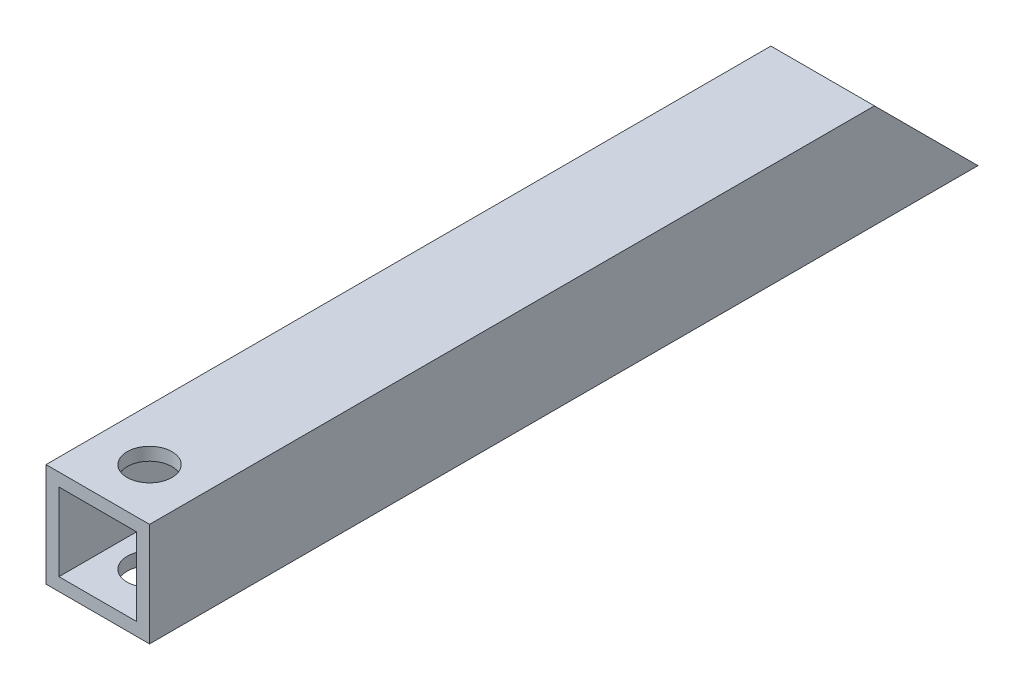
ISO-10303-21;
HEADER;
FILE_DESCRIPTION(('STEP AP214'),'2;1');
FILE_NAME('part.step','',(''),(''),'','','');
FILE_SCHEMA(('AUTOMOTIVE_DESIGN { 1 0 10303 214 1 1 1 1 }'));
ENDSEC;
DATA;
#1=APPLICATION_CONTEXT('core data for automotive mechanical design processes');
#2=APPLICATION_PROTOCOL_DEFINITION('international standard','automotive_design',2000,#1);
#3=PRODUCT_CONTEXT('',#1,'mechanical');
#4=PRODUCT('Part','Part','',(#3));
#5=PRODUCT_RELATED_PRODUCT_CATEGORY('part','',(#4));
#6=PRODUCT_DEFINITION_FORMATION('','',#4);
#7=PRODUCT_DEFINITION_CONTEXT('part definition',#1,'design');
#8=PRODUCT_DEFINITION('design','',#6,#7);
#9=PRODUCT_DEFINITION_SHAPE('','',#8);
#10=(LENGTH_UNIT() NAMED_UNIT(*) SI_UNIT(.MILLI.,.METRE.));
#11=(NAMED_UNIT(*) PLANE_ANGLE_UNIT() SI_UNIT($,.RADIAN.));
#12=(NAMED_UNIT(*) SI_UNIT($,.STERADIAN.) SOLID_ANGLE_UNIT());
#13=UNCERTAINTY_MEASURE_WITH_UNIT(LENGTH_MEASURE(1.E-05),#10,'distance_accuracy_value','');
#14=(GEOMETRIC_REPRESENTATION_CONTEXT(3) GLOBAL_UNCERTAINTY_ASSIGNED_CONTEXT((#13)) GLOBAL_UNIT_ASSIGNED_CONTEXT((#10,
#11,#12)) REPRESENTATION_CONTEXT('',''));
#15=CARTESIAN_POINT('',(0.,0.,0.));
#16=DIRECTION('',(0.,0.,1.));
#17=DIRECTION('',(1.,0.,0.));
#18=AXIS2_PLACEMENT_3D('',#15,#16,#17);
#19=CARTESIAN_POINT('',(0.,0.,203.2));
#20=DIRECTION('',(0.,0.,1.));
#21=DIRECTION('',(1.,0.,0.));
#22=AXIS2_PLACEMENT_3D('',#19,#20,#21);
#23=PLANE('',#22);
#24=DIRECTION('',(0.,-1.,0.));
#25=VECTOR('',#24,1.);
#26=CARTESIAN_POINT('',(-12.7,-12.7,203.2));
#27=LINE('',#26,#25);
#28=CARTESIAN_POINT('',(-12.7,12.7,203.2));
#29=VERTEX_POINT('',#28);
#30=CARTESIAN_POINT('',(-12.7,-12.7,203.2));
#31=VERTEX_POINT('',#30);
#32=EDGE_CURVE('E109',#29,#31,#27,.T.);
#33=ORIENTED_EDGE('',*,*,#32,.T.);
#34=DIRECTION('',(1.,0.,0.));
#35=VECTOR('',#34,1.);
#36=CARTESIAN_POINT('',(12.7,-12.7,203.2));
#37=LINE('',#36,#35);
#38=CARTESIAN_POINT('',(12.7,-12.7,203.2));
#39=VERTEX_POINT('',#38);
#40=EDGE_CURVE('E121',#31,#39,#37,.T.);
#41=ORIENTED_EDGE('',*,*,#40,.T.);
#42=DIRECTION('',(0.,1.,0.));
#43=VECTOR('',#42,1.);
#44=CARTESIAN_POINT('',(12.7,-12.7,203.2));
#45=LINE('',#44,#43);
#46=CARTESIAN_POINT('',(12.7,12.7,203.2));
#47=VERTEX_POINT('',#46);
#48=EDGE_CURVE('E132',#39,#47,#45,.T.);
#49=ORIENTED_EDGE('',*,*,#48,.T.);
#50=DIRECTION('',(-1.,0.,0.));
#51=VECTOR('',#50,1.);
#52=CARTESIAN_POINT('',(12.7,12.7,203.2));
#53=LINE('',#52,#51);
#54=EDGE_CURVE('E129',#47,#29,#53,.T.);
#55=ORIENTED_EDGE('',*,*,#54,.T.);
#56=EDGE_LOOP('',(#33,#41,#49,#55));
#57=FACE_BOUND('',#56,.T.);
#58=DIRECTION('',(-1.,0.,0.));
#59=VECTOR('',#58,1.);
#60=CARTESIAN_POINT('',(9.525,9.525,203.2));
#61=LINE('',#60,#59);
#62=CARTESIAN_POINT('',(9.525,9.525,203.2));
#63=VERTEX_POINT('',#62);
#64=CARTESIAN_POINT('',(-9.525,9.525,203.2));
#65=VERTEX_POINT('',#64);
#66=EDGE_CURVE('E152',#63,#65,#61,.T.);
#67=ORIENTED_EDGE('',*,*,#66,.F.);
#68=DIRECTION('',(0.,1.,0.));
#69=VECTOR('',#68,1.);
#70=CARTESIAN_POINT('',(9.525,-9.525,203.2));
#71=LINE('',#70,#69);
#72=CARTESIAN_POINT('',(9.525,-9.525,203.2));
#73=VERTEX_POINT('',#72);
#74=EDGE_CURVE('E154',#73,#63,#71,.T.);
#75=ORIENTED_EDGE('',*,*,#74,.F.);
#76=DIRECTION('',(1.,0.,0.));
#77=VECTOR('',#76,1.);
#78=CARTESIAN_POINT('',(9.525,-9.525,203.2));
#79=LINE('',#78,#77);
#80=CARTESIAN_POINT('',(-9.525,-9.525,203.2));
#81=VERTEX_POINT('',#80);
#82=EDGE_CURVE('E147',#81,#73,#79,.T.);
#83=ORIENTED_EDGE('',*,*,#82,.F.);
#84=DIRECTION('',(0.,-1.,0.));
#85=VECTOR('',#84,1.);
#86=CARTESIAN_POINT('',(-9.525,-9.525,203.2));
#87=LINE('',#86,#85);
#88=EDGE_CURVE('E149',#65,#81,#87,.T.);
#89=ORIENTED_EDGE('',*,*,#88,.F.);
#90=EDGE_LOOP('',(#67,#75,#83,#89));
#91=FACE_BOUND('',#90,.T.);
#92=ADVANCED_FACE('F39',(#57,#91),#23,.T.);
#93=CARTESIAN_POINT('',(-12.7,-12.7,203.2));
#94=DIRECTION('',(1.,0.,0.));
#95=DIRECTION('',(0.,0.,-1.));
#96=AXIS2_PLACEMENT_3D('',#93,#94,#95);
#97=PLANE('',#96);
#98=DIRECTION('',(0.,0.,-1.));
#99=VECTOR('',#98,1.);
#100=CARTESIAN_POINT('',(-12.7,12.7,203.2));
#101=LINE('',#100,#99);
#102=CARTESIAN_POINT('',(-12.7,12.7,25.4000000000003));
#103=VERTEX_POINT('',#102);
#104=EDGE_CURVE('E117',#29,#103,#101,.T.);
#105=ORIENTED_EDGE('',*,*,#104,.T.);
#106=DIRECTION('',(0.,-0.707106781186544,-0.707106781186551));
#107=VECTOR('',#106,1.);
#108=CARTESIAN_POINT('',(-12.7,-12.7,0.));
#109=LINE('',#108,#107);
#110=CARTESIAN_POINT('',(-12.7,-12.7,0.));
#111=VERTEX_POINT('',#110);
#112=EDGE_CURVE('E54',#103,#111,#109,.T.);
#113=ORIENTED_EDGE('',*,*,#112,.T.);
#114=DIRECTION('',(0.,0.,-1.));
#115=VECTOR('',#114,1.);
#116=CARTESIAN_POINT('',(-12.7,-12.7,203.2));
#117=LINE('',#116,#115);
#118=EDGE_CURVE('E47',#31,#111,#117,.T.);
#119=ORIENTED_EDGE('',*,*,#118,.F.);
#120=ORIENTED_EDGE('',*,*,#32,.F.);
#121=EDGE_LOOP('',(#105,#113,#119,#120));
#122=FACE_BOUND('',#121,.T.);
#123=ADVANCED_FACE('F41',(#122),#97,.F.);
#124=CARTESIAN_POINT('',(12.7,-12.7,203.2));
#125=DIRECTION('',(0.,1.,0.));
#126=DIRECTION('',(-1.,0.,0.));
#127=AXIS2_PLACEMENT_3D('',#124,#125,#126);
#128=PLANE('',#127);
#129=CARTESIAN_POINT('',(0.,-12.7,190.5));
#130=DIRECTION('',(0.,-1.,0.));
#131=DIRECTION('',(0.,0.,-1.));
#132=AXIS2_PLACEMENT_3D('',#129,#130,#131);
#133=CIRCLE('',#132,5.49999999999999);
#134=CARTESIAN_POINT('',(0.,-12.7,185.));
#135=VERTEX_POINT('',#134);
#136=EDGE_CURVE('E172',#135,#135,#133,.T.);
#137=ORIENTED_EDGE('',*,*,#136,.F.);
#138=EDGE_LOOP('',(#137));
#139=FACE_BOUND('',#138,.T.);
#140=DIRECTION('',(1.,0.,0.));
#141=VECTOR('',#140,1.);
#142=CARTESIAN_POINT('',(12.7,-12.7,0.));
#143=LINE('',#142,#141);
#144=CARTESIAN_POINT('',(12.7,-12.7,0.));
#145=VERTEX_POINT('',#144);
#146=EDGE_CURVE('E101',#111,#145,#143,.T.);
#147=ORIENTED_EDGE('',*,*,#146,.T.);
#148=DIRECTION('',(0.,0.,-1.));
#149=VECTOR('',#148,1.);
#150=CARTESIAN_POINT('',(12.7,-12.7,203.2));
#151=LINE('',#150,#149);
#152=EDGE_CURVE('E123',#39,#145,#151,.T.);
#153=ORIENTED_EDGE('',*,*,#152,.F.);
#154=ORIENTED_EDGE('',*,*,#40,.F.);
#155=ORIENTED_EDGE('',*,*,#118,.T.);
#156=EDGE_LOOP('',(#147,#153,#154,#155));
#157=FACE_BOUND('',#156,.T.);
#158=ADVANCED_FACE('F120',(#139,#157),#128,.F.);
#159=CARTESIAN_POINT('',(12.7,-12.7,203.2));
#160=DIRECTION('',(-1.,0.,0.));
#161=DIRECTION('',(0.,0.,1.));
#162=AXIS2_PLACEMENT_3D('',#159,#160,#161);
#163=PLANE('',#162);
#164=ORIENTED_EDGE('',*,*,#152,.T.);
#165=DIRECTION('',(0.,-0.707106781186544,-0.707106781186551));
#166=VECTOR('',#165,1.);
#167=CARTESIAN_POINT('',(12.7,-12.7,0.));
#168=LINE('',#167,#166);
#169=CARTESIAN_POINT('',(12.7,12.7,25.4000000000003));
#170=VERTEX_POINT('',#169);
#171=EDGE_CURVE('E104',#170,#145,#168,.T.);
#172=ORIENTED_EDGE('',*,*,#171,.F.);
#173=DIRECTION('',(0.,0.,-1.));
#174=VECTOR('',#173,1.);
#175=CARTESIAN_POINT('',(12.7,12.7,203.2));
#176=LINE('',#175,#174);
#177=EDGE_CURVE('E124',#47,#170,#176,.T.);
#178=ORIENTED_EDGE('',*,*,#177,.F.);
#179=ORIENTED_EDGE('',*,*,#48,.F.);
#180=EDGE_LOOP('',(#164,#172,#178,#179));
#181=FACE_BOUND('',#180,.T.);
#182=ADVANCED_FACE('F179',(#181),#163,.F.);
#183=CARTESIAN_POINT('',(12.7,12.7,203.2));
#184=DIRECTION('',(0.,-1.,0.));
#185=DIRECTION('',(1.,0.,0.));
#186=AXIS2_PLACEMENT_3D('',#183,#184,#185);
#187=PLANE('',#186);
#188=CARTESIAN_POINT('',(0.,12.7,190.5));
#189=DIRECTION('',(0.,-1.,0.));
#190=DIRECTION('',(0.,0.,-1.));
#191=AXIS2_PLACEMENT_3D('',#188,#189,#190);
#192=CIRCLE('',#191,5.5);
#193=CARTESIAN_POINT('',(0.,12.7,185.));
#194=VERTEX_POINT('',#193);
#195=EDGE_CURVE('E169',#194,#194,#192,.T.);
#196=ORIENTED_EDGE('',*,*,#195,.T.);
#197=EDGE_LOOP('',(#196));
#198=FACE_BOUND('',#197,.T.);
#199=ORIENTED_EDGE('',*,*,#177,.T.);
#200=DIRECTION('',(1.,0.,0.));
#201=VECTOR('',#200,1.);
#202=CARTESIAN_POINT('',(-12.7,12.7,25.4000000000003));
#203=LINE('',#202,#201);
#204=EDGE_CURVE('E118',#103,#170,#203,.T.);
#205=ORIENTED_EDGE('',*,*,#204,.F.);
#206=ORIENTED_EDGE('',*,*,#104,.F.);
#207=ORIENTED_EDGE('',*,*,#54,.F.);
#208=EDGE_LOOP('',(#199,#205,#206,#207));
#209=FACE_BOUND('',#208,.T.);
#210=ADVANCED_FACE('F184',(#198,#209),#187,.F.);
#211=CARTESIAN_POINT('',(9.525,-9.525,203.2));
#212=DIRECTION('',(-1.,0.,0.));
#213=DIRECTION('',(0.,0.,1.));
#214=AXIS2_PLACEMENT_3D('',#211,#212,#213);
#215=PLANE('',#214);
#216=DIRECTION('',(0.,0.707106781186544,0.707106781186551));
#217=VECTOR('',#216,1.);
#218=CARTESIAN_POINT('',(9.525,90.4875,103.187500000001));
#219=LINE('',#218,#217);
#220=CARTESIAN_POINT('',(9.525,-9.525,3.17500000000004));
#221=VERTEX_POINT('',#220);
#222=CARTESIAN_POINT('',(9.525,9.525,22.2250000000002));
#223=VERTEX_POINT('',#222);
#224=EDGE_CURVE('E156',#221,#223,#219,.T.);
#225=ORIENTED_EDGE('',*,*,#224,.F.);
#226=DIRECTION('',(0.,0.,-1.));
#227=VECTOR('',#226,1.);
#228=CARTESIAN_POINT('',(9.525,-9.525,203.2));
#229=LINE('',#228,#227);
#230=EDGE_CURVE('E144',#73,#221,#229,.T.);
#231=ORIENTED_EDGE('',*,*,#230,.F.);
#232=ORIENTED_EDGE('',*,*,#74,.T.);
#233=DIRECTION('',(0.,0.,-1.));
#234=VECTOR('',#233,1.);
#235=CARTESIAN_POINT('',(9.525,9.525,203.2));
#236=LINE('',#235,#234);
#237=EDGE_CURVE('E110',#63,#223,#236,.T.);
#238=ORIENTED_EDGE('',*,*,#237,.T.);
#239=EDGE_LOOP('',(#225,#231,#232,#238));
#240=FACE_BOUND('',#239,.T.);
#241=ADVANCED_FACE('F195',(#240),#215,.T.);
#242=CARTESIAN_POINT('',(9.525,9.525,203.2));
#243=DIRECTION('',(0.,-1.,0.));
#244=DIRECTION('',(1.,0.,0.));
#245=AXIS2_PLACEMENT_3D('',#242,#243,#244);
#246=PLANE('',#245);
#247=CARTESIAN_POINT('',(0.,9.525,190.5));
#248=DIRECTION('',(0.,-1.,0.));
#249=DIRECTION('',(1.,0.,0.));
#250=AXIS2_PLACEMENT_3D('',#247,#248,#249);
#251=CIRCLE('',#250,5.49999999999999);
#252=CARTESIAN_POINT('',(5.49999999999999,9.52500000000001,190.5));
#253=VERTEX_POINT('',#252);
#254=EDGE_CURVE('E162',#253,#253,#251,.T.);
#255=ORIENTED_EDGE('',*,*,#254,.F.);
#256=EDGE_LOOP('',(#255));
#257=FACE_BOUND('',#256,.T.);
#258=DIRECTION('',(-1.,0.,0.));
#259=VECTOR('',#258,1.);
#260=CARTESIAN_POINT('',(9.52500000000003,9.525,22.2250000000002));
#261=LINE('',#260,#259);
#262=CARTESIAN_POINT('',(-9.525,9.52499999999999,22.2250000000002));
#263=VERTEX_POINT('',#262);
#264=EDGE_CURVE('E158',#223,#263,#261,.T.);
#265=ORIENTED_EDGE('',*,*,#264,.F.);
#266=ORIENTED_EDGE('',*,*,#237,.F.);
#267=ORIENTED_EDGE('',*,*,#66,.T.);
#268=DIRECTION('',(0.,0.,-1.));
#269=VECTOR('',#268,1.);
#270=CARTESIAN_POINT('',(-9.525,9.525,203.2));
#271=LINE('',#270,#269);
#272=EDGE_CURVE('E138',#65,#263,#271,.T.);
#273=ORIENTED_EDGE('',*,*,#272,.T.);
#274=EDGE_LOOP('',(#265,#266,#267,#273));
#275=FACE_BOUND('',#274,.T.);
#276=ADVANCED_FACE('F202',(#257,#275),#246,.T.);
#277=CARTESIAN_POINT('',(-9.525,-9.525,203.2));
#278=DIRECTION('',(1.,0.,0.));
#279=DIRECTION('',(0.,0.,-1.));
#280=AXIS2_PLACEMENT_3D('',#277,#278,#279);
#281=PLANE('',#280);
#282=DIRECTION('',(0.,-0.707106781186544,-0.707106781186551));
#283=VECTOR('',#282,1.);
#284=CARTESIAN_POINT('',(-9.525,90.4875,103.187500000001));
#285=LINE('',#284,#283);
#286=CARTESIAN_POINT('',(-9.525,-9.525,3.17500000000004));
#287=VERTEX_POINT('',#286);
#288=EDGE_CURVE('E61',#263,#287,#285,.T.);
#289=ORIENTED_EDGE('',*,*,#288,.F.);
#290=ORIENTED_EDGE('',*,*,#272,.F.);
#291=ORIENTED_EDGE('',*,*,#88,.T.);
#292=DIRECTION('',(0.,0.,-1.));
#293=VECTOR('',#292,1.);
#294=CARTESIAN_POINT('',(-9.525,-9.525,203.2));
#295=LINE('',#294,#293);
#296=EDGE_CURVE('E141',#81,#287,#295,.T.);
#297=ORIENTED_EDGE('',*,*,#296,.T.);
#298=EDGE_LOOP('',(#289,#290,#291,#297));
#299=FACE_BOUND('',#298,.T.);
#300=ADVANCED_FACE('F224',(#299),#281,.T.);
#301=CARTESIAN_POINT('',(9.525,-9.525,203.2));
#302=DIRECTION('',(0.,1.,0.));
#303=DIRECTION('',(-1.,0.,0.));
#304=AXIS2_PLACEMENT_3D('',#301,#302,#303);
#305=PLANE('',#304);
#306=CARTESIAN_POINT('',(0.,-9.525,190.5));
#307=DIRECTION('',(0.,1.,0.));
#308=DIRECTION('',(-1.,0.,0.));
#309=AXIS2_PLACEMENT_3D('',#306,#307,#308);
#310=CIRCLE('',#309,5.49999999999999);
#311=CARTESIAN_POINT('',(-5.49999999999999,-9.525,190.5));
#312=VERTEX_POINT('',#311);
#313=EDGE_CURVE('E166',#312,#312,#310,.T.);
#314=ORIENTED_EDGE('',*,*,#313,.F.);
#315=EDGE_LOOP('',(#314));
#316=FACE_BOUND('',#315,.T.);
#317=DIRECTION('',(1.,0.,0.));
#318=VECTOR('',#317,1.);
#319=CARTESIAN_POINT('',(9.52500000000003,-9.525,3.17500000000004));
#320=LINE('',#319,#318);
#321=EDGE_CURVE('E11',#287,#221,#320,.T.);
#322=ORIENTED_EDGE('',*,*,#321,.F.);
#323=ORIENTED_EDGE('',*,*,#296,.F.);
#324=ORIENTED_EDGE('',*,*,#82,.T.);
#325=ORIENTED_EDGE('',*,*,#230,.T.);
#326=EDGE_LOOP('',(#322,#323,#324,#325));
#327=FACE_BOUND('',#326,.T.);
#328=ADVANCED_FACE('F219',(#316,#327),#305,.T.);
#329=CARTESIAN_POINT('',(-12.7,-12.7,0.));
#330=DIRECTION('',(0.,-0.707106781186551,0.707106781186543));
#331=DIRECTION('',(0.,-0.707106781186544,-0.707106781186551));
#332=AXIS2_PLACEMENT_3D('',#329,#330,#331);
#333=PLANE('',#332);
#334=ORIENTED_EDGE('',*,*,#224,.T.);
#335=ORIENTED_EDGE('',*,*,#264,.T.);
#336=ORIENTED_EDGE('',*,*,#288,.T.);
#337=ORIENTED_EDGE('',*,*,#321,.T.);
#338=EDGE_LOOP('',(#334,#335,#336,#337));
#339=FACE_BOUND('',#338,.T.);
#340=ORIENTED_EDGE('',*,*,#171,.T.);
#341=ORIENTED_EDGE('',*,*,#146,.F.);
#342=ORIENTED_EDGE('',*,*,#112,.F.);
#343=ORIENTED_EDGE('',*,*,#204,.T.);
#344=EDGE_LOOP('',(#340,#341,#342,#343));
#345=FACE_BOUND('',#344,.T.);
#346=ADVANCED_FACE('F102',(#339,#345),#333,.F.);
#347=CARTESIAN_POINT('',(0.,-12.7,190.5));
#348=DIRECTION('',(0.,-1.,0.));
#349=DIRECTION('',(0.,0.,-1.));
#350=AXIS2_PLACEMENT_3D('',#347,#348,#349);
#351=CYLINDRICAL_SURFACE('',#350,5.49999999999999);
#352=ORIENTED_EDGE('',*,*,#254,.T.);
#353=EDGE_LOOP('',(#352));
#354=FACE_BOUND('',#353,.T.);
#355=ORIENTED_EDGE('',*,*,#195,.F.);
#356=EDGE_LOOP('',(#355));
#357=FACE_BOUND('',#356,.T.);
#358=ADVANCED_FACE('F210',(#354,#357),#351,.F.);
#359=ORIENTED_EDGE('',*,*,#313,.T.);
#360=EDGE_LOOP('',(#359));
#361=FACE_BOUND('',#360,.T.);
#362=ORIENTED_EDGE('',*,*,#136,.T.);
#363=EDGE_LOOP('',(#362));
#364=FACE_BOUND('',#363,.T.);
#365=ADVANCED_FACE('F176',(#361,#364),#351,.F.);
#366=CLOSED_SHELL('',(#92,#123,#158,#182,#210,#241,#276,#300,#328,#346,#358,#365));
#367=MANIFOLD_SOLID_BREP('B2',#366);
#368=ADVANCED_BREP_SHAPE_REPRESENTATION('',(#18,#367),#14);
#369=SHAPE_DEFINITION_REPRESENTATION(#9,#368);
ENDSEC;
END-ISO-10303-21;
